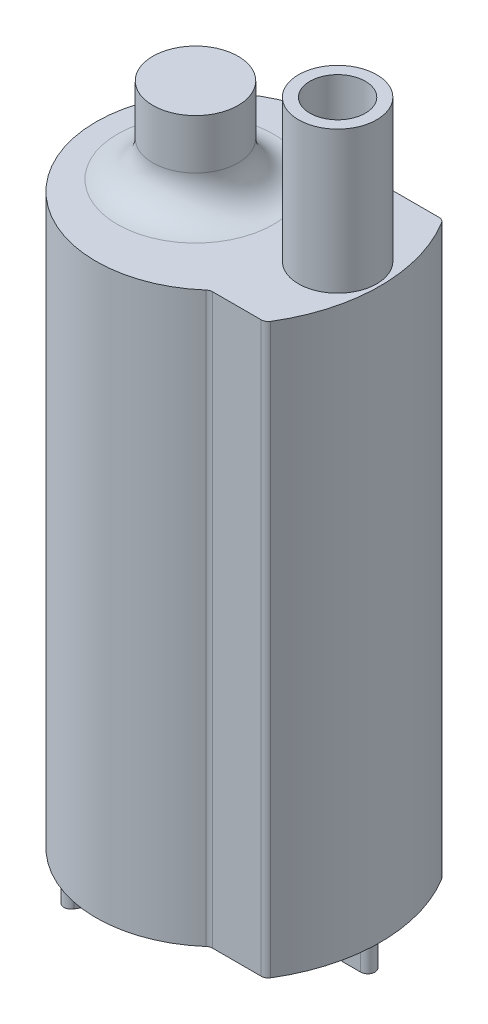
ISO-10303-21;
HEADER;
FILE_DESCRIPTION(('STEP AP214'),'2;1');
FILE_NAME('part.step','',(''),(''),'','','');
FILE_SCHEMA(('AUTOMOTIVE_DESIGN { 1 0 10303 214 1 1 1 1 }'));
ENDSEC;
DATA;
#1=APPLICATION_CONTEXT('core data for automotive mechanical design processes');
#2=APPLICATION_PROTOCOL_DEFINITION('international standard','automotive_design',2000,#1);
#3=PRODUCT_CONTEXT('',#1,'mechanical');
#4=PRODUCT('Part','Part','',(#3));
#5=PRODUCT_RELATED_PRODUCT_CATEGORY('part','',(#4));
#6=PRODUCT_DEFINITION_FORMATION('','',#4);
#7=PRODUCT_DEFINITION_CONTEXT('part definition',#1,'design');
#8=PRODUCT_DEFINITION('design','',#6,#7);
#9=PRODUCT_DEFINITION_SHAPE('','',#8);
#10=(LENGTH_UNIT() NAMED_UNIT(*) SI_UNIT(.MILLI.,.METRE.));
#11=(NAMED_UNIT(*) PLANE_ANGLE_UNIT() SI_UNIT($,.RADIAN.));
#12=(NAMED_UNIT(*) SI_UNIT($,.STERADIAN.) SOLID_ANGLE_UNIT());
#13=UNCERTAINTY_MEASURE_WITH_UNIT(LENGTH_MEASURE(1.E-05),#10,'distance_accuracy_value','');
#14=(GEOMETRIC_REPRESENTATION_CONTEXT(3) GLOBAL_UNCERTAINTY_ASSIGNED_CONTEXT((#13)) GLOBAL_UNIT_ASSIGNED_CONTEXT((#10,
#11,#12)) REPRESENTATION_CONTEXT('',''));
#15=CARTESIAN_POINT('',(0.,0.,0.));
#16=DIRECTION('',(0.,0.,1.));
#17=DIRECTION('',(1.,0.,0.));
#18=AXIS2_PLACEMENT_3D('',#15,#16,#17);
#19=CARTESIAN_POINT('',(0.,0.,0.));
#20=DIRECTION('',(0.,1.,0.));
#21=DIRECTION('',(0.,0.,1.));
#22=AXIS2_PLACEMENT_3D('',#19,#20,#21);
#23=PLANE('',#22);
#24=CARTESIAN_POINT('',(-6.25000000000005,0.,-10.8253175473055));
#25=DIRECTION('',(0.,-1.,0.));
#26=DIRECTION('',(0.,0.,-1.));
#27=AXIS2_PLACEMENT_3D('',#24,#25,#26);
#28=CIRCLE('',#27,0.999999999999999);
#29=CARTESIAN_POINT('',(-5.38397459621561,0.,-11.3253175473055));
#30=VERTEX_POINT('',#29);
#31=CARTESIAN_POINT('',(-7.11602540378449,0.,-10.3253175473055));
#32=VERTEX_POINT('',#31);
#33=EDGE_CURVE('E194',#30,#32,#28,.T.);
#34=ORIENTED_EDGE('',*,*,#33,.F.);
#35=DIRECTION('',(0.500000000000004,0.,0.866025403784436));
#36=VECTOR('',#35,1.);
#37=CARTESIAN_POINT('',(-5.38397459621561,0.,-11.3253175473055));
#38=LINE('',#37,#36);
#39=CARTESIAN_POINT('',(-6.63397459621563,0.,-13.4903810567665));
#40=VERTEX_POINT('',#39);
#41=EDGE_CURVE('E207',#40,#30,#38,.T.);
#42=ORIENTED_EDGE('',*,*,#41,.F.);
#43=CARTESIAN_POINT('',(-7.50000000000006,0.,-12.9903810567665));
#44=DIRECTION('',(0.,-1.,0.));
#45=DIRECTION('',(0.,0.,-1.));
#46=AXIS2_PLACEMENT_3D('',#43,#44,#45);
#47=CIRCLE('',#46,0.999999999999998);
#48=CARTESIAN_POINT('',(-8.3660254037845,0.,-12.4903810567665));
#49=VERTEX_POINT('',#48);
#50=EDGE_CURVE('E216',#49,#40,#47,.T.);
#51=ORIENTED_EDGE('',*,*,#50,.F.);
#52=DIRECTION('',(-0.500000000000003,0.,-0.866025403784437));
#53=VECTOR('',#52,1.);
#54=CARTESIAN_POINT('',(-7.11602540378449,0.,-10.3253175473055));
#55=LINE('',#54,#53);
#56=EDGE_CURVE('E197',#32,#49,#55,.T.);
#57=ORIENTED_EDGE('',*,*,#56,.F.);
#58=EDGE_LOOP('',(#34,#42,#51,#57));
#59=FACE_BOUND('',#58,.T.);
#60=DIRECTION('',(-1.,0.,0.));
#61=VECTOR('',#60,1.);
#62=CARTESIAN_POINT('',(11.5217186218029,0.,-12.5));
#63=LINE('',#62,#61);
#64=CARTESIAN_POINT('',(18.7549993335111,0.,-12.5));
#65=VERTEX_POINT('',#64);
#66=CARTESIAN_POINT('',(11.9058808997907,0.,-12.5));
#67=VERTEX_POINT('',#66);
#68=EDGE_CURVE('E281',#65,#67,#63,.T.);
#69=ORIENTED_EDGE('',*,*,#68,.F.);
#70=CARTESIAN_POINT('',(18.7549993335111,0.,-11.5));
#71=DIRECTION('',(0.,1.,0.));
#72=DIRECTION('',(0.,0.,1.));
#73=AXIS2_PLACEMENT_3D('',#70,#71,#72);
#74=CIRCLE('',#73,1.);
#75=CARTESIAN_POINT('',(19.6074993032161,0.,-12.0227272727273));
#76=VERTEX_POINT('',#75);
#77=EDGE_CURVE('E314',#65,#76,#74,.F.);
#78=ORIENTED_EDGE('',*,*,#77,.T.);
#79=CARTESIAN_POINT('',(0.,0.,0.));
#80=DIRECTION('',(0.,1.,0.));
#81=DIRECTION('',(0.,0.,1.));
#82=AXIS2_PLACEMENT_3D('',#79,#80,#81);
#83=CIRCLE('',#82,23.);
#84=CARTESIAN_POINT('',(19.6074993032161,0.,12.0227272727273));
#85=VERTEX_POINT('',#84);
#86=EDGE_CURVE('E294',#85,#76,#83,.T.);
#87=ORIENTED_EDGE('',*,*,#86,.F.);
#88=CARTESIAN_POINT('',(18.7549993335111,0.,11.5));
#89=DIRECTION('',(0.,1.,0.));
#90=DIRECTION('',(0.,0.,1.));
#91=AXIS2_PLACEMENT_3D('',#88,#89,#90);
#92=CIRCLE('',#91,1.);
#93=CARTESIAN_POINT('',(18.7549993335111,0.,12.5));
#94=VERTEX_POINT('',#93);
#95=EDGE_CURVE('E312',#85,#94,#92,.F.);
#96=ORIENTED_EDGE('',*,*,#95,.T.);
#97=DIRECTION('',(1.,0.,0.));
#98=VECTOR('',#97,1.);
#99=CARTESIAN_POINT('',(19.3067345763078,0.,12.5));
#100=LINE('',#99,#98);
#101=CARTESIAN_POINT('',(11.9058808997907,0.,12.5));
#102=VERTEX_POINT('',#101);
#103=EDGE_CURVE('E292',#102,#94,#100,.T.);
#104=ORIENTED_EDGE('',*,*,#103,.F.);
#105=CARTESIAN_POINT('',(11.9058808997907,0.,13.5));
#106=DIRECTION('',(0.,1.,0.));
#107=DIRECTION('',(0.,0.,1.));
#108=AXIS2_PLACEMENT_3D('',#105,#106,#107);
#109=CIRCLE('',#108,1.);
#110=CARTESIAN_POINT('',(11.2444430720245,0.,12.75));
#111=VERTEX_POINT('',#110);
#112=EDGE_CURVE('E40',#102,#111,#109,.T.);
#113=ORIENTED_EDGE('',*,*,#112,.T.);
#114=CARTESIAN_POINT('',(0.,0.,0.));
#115=DIRECTION('',(0.,1.,0.));
#116=DIRECTION('',(0.,0.,1.));
#117=AXIS2_PLACEMENT_3D('',#114,#115,#116);
#118=CIRCLE('',#117,17.);
#119=CARTESIAN_POINT('',(11.2444430720245,0.,-12.75));
#120=VERTEX_POINT('',#119);
#121=EDGE_CURVE('E275',#120,#111,#118,.T.);
#122=ORIENTED_EDGE('',*,*,#121,.F.);
#123=CARTESIAN_POINT('',(11.9058808997907,0.,-13.5));
#124=DIRECTION('',(0.,1.,0.));
#125=DIRECTION('',(0.,0.,1.));
#126=AXIS2_PLACEMENT_3D('',#123,#124,#125);
#127=CIRCLE('',#126,1.);
#128=EDGE_CURVE('E334',#120,#67,#127,.T.);
#129=ORIENTED_EDGE('',*,*,#128,.T.);
#130=EDGE_LOOP('',(#69,#78,#87,#96,#104,#113,#122,#129));
#131=FACE_BOUND('',#130,.T.);
#132=CARTESIAN_POINT('',(-6.25000000000005,0.,10.8253175473054));
#133=DIRECTION('',(0.,-1.,0.));
#134=DIRECTION('',(0.,0.,-1.));
#135=AXIS2_PLACEMENT_3D('',#132,#133,#134);
#136=CIRCLE('',#135,1.);
#137=CARTESIAN_POINT('',(-7.11602540378449,0.,10.3253175473054));
#138=VERTEX_POINT('',#137);
#139=CARTESIAN_POINT('',(-5.38397459621562,0.,11.3253175473055));
#140=VERTEX_POINT('',#139);
#141=EDGE_CURVE('E232',#138,#140,#136,.T.);
#142=ORIENTED_EDGE('',*,*,#141,.F.);
#143=DIRECTION('',(0.500000000000005,0.,-0.866025403784436));
#144=VECTOR('',#143,1.);
#145=CARTESIAN_POINT('',(-7.11602540378449,0.,10.3253175473054));
#146=LINE('',#145,#144);
#147=CARTESIAN_POINT('',(-8.3660254037845,0.,12.4903810567665));
#148=VERTEX_POINT('',#147);
#149=EDGE_CURVE('E237',#148,#138,#146,.T.);
#150=ORIENTED_EDGE('',*,*,#149,.F.);
#151=CARTESIAN_POINT('',(-7.50000000000006,0.,12.9903810567665));
#152=DIRECTION('',(0.,-1.,0.));
#153=DIRECTION('',(0.,0.,-1.));
#154=AXIS2_PLACEMENT_3D('',#151,#152,#153);
#155=CIRCLE('',#154,1.);
#156=CARTESIAN_POINT('',(-6.63397459621563,0.,13.4903810567665));
#157=VERTEX_POINT('',#156);
#158=EDGE_CURVE('E249',#157,#148,#155,.T.);
#159=ORIENTED_EDGE('',*,*,#158,.F.);
#160=DIRECTION('',(-0.500000000000004,0.,0.866025403784436));
#161=VECTOR('',#160,1.);
#162=CARTESIAN_POINT('',(-5.38397459621562,0.,11.3253175473055));
#163=LINE('',#162,#161);
#164=EDGE_CURVE('E246',#140,#157,#163,.T.);
#165=ORIENTED_EDGE('',*,*,#164,.F.);
#166=EDGE_LOOP('',(#142,#150,#159,#165));
#167=FACE_BOUND('',#166,.T.);
#168=CARTESIAN_POINT('',(18.75,0.,0.));
#169=DIRECTION('',(0.,-1.,0.));
#170=DIRECTION('',(0.,0.,-1.));
#171=AXIS2_PLACEMENT_3D('',#168,#169,#170);
#172=CIRCLE('',#171,1.);
#173=CARTESIAN_POINT('',(18.75,0.,1.));
#174=VERTEX_POINT('',#173);
#175=CARTESIAN_POINT('',(18.75,0.,-1.));
#176=VERTEX_POINT('',#175);
#177=EDGE_CURVE('E193',#174,#176,#172,.T.);
#178=ORIENTED_EDGE('',*,*,#177,.F.);
#179=DIRECTION('',(-1.,0.,0.));
#180=VECTOR('',#179,1.);
#181=CARTESIAN_POINT('',(18.75,0.,1.));
#182=LINE('',#181,#180);
#183=CARTESIAN_POINT('',(21.25,0.,1.));
#184=VERTEX_POINT('',#183);
#185=EDGE_CURVE('E190',#184,#174,#182,.T.);
#186=ORIENTED_EDGE('',*,*,#185,.F.);
#187=CARTESIAN_POINT('',(21.25,0.,0.));
#188=DIRECTION('',(0.,-1.,0.));
#189=DIRECTION('',(0.,0.,-1.));
#190=AXIS2_PLACEMENT_3D('',#187,#188,#189);
#191=CIRCLE('',#190,1.);
#192=CARTESIAN_POINT('',(21.25,0.,-1.));
#193=VERTEX_POINT('',#192);
#194=EDGE_CURVE('E679',#193,#184,#191,.T.);
#195=ORIENTED_EDGE('',*,*,#194,.F.);
#196=DIRECTION('',(1.,0.,0.));
#197=VECTOR('',#196,1.);
#198=CARTESIAN_POINT('',(18.75,0.,-1.));
#199=LINE('',#198,#197);
#200=EDGE_CURVE('E685',#176,#193,#199,.T.);
#201=ORIENTED_EDGE('',*,*,#200,.F.);
#202=EDGE_LOOP('',(#178,#186,#195,#201));
#203=FACE_BOUND('',#202,.T.);
#204=ADVANCED_FACE('F32',(#59,#131,#167,#203),#23,.F.);
#205=CARTESIAN_POINT('',(0.,80.,0.));
#206=DIRECTION('',(0.,-1.,0.));
#207=DIRECTION('',(0.,0.,-1.));
#208=AXIS2_PLACEMENT_3D('',#205,#206,#207);
#209=CYLINDRICAL_SURFACE('',#208,17.);
#210=CARTESIAN_POINT('',(0.,80.,0.));
#211=DIRECTION('',(0.,1.,0.));
#212=DIRECTION('',(0.,0.,1.));
#213=AXIS2_PLACEMENT_3D('',#210,#211,#212);
#214=CIRCLE('',#213,17.);
#215=CARTESIAN_POINT('',(11.2444430720245,80.,-12.75));
#216=VERTEX_POINT('',#215);
#217=CARTESIAN_POINT('',(11.2444430720245,80.,12.75));
#218=VERTEX_POINT('',#217);
#219=EDGE_CURVE('E278',#216,#218,#214,.T.);
#220=ORIENTED_EDGE('',*,*,#219,.F.);
#221=DIRECTION('',(0.,-1.,0.));
#222=VECTOR('',#221,1.);
#223=CARTESIAN_POINT('',(11.2444430720245,80.,-12.75));
#224=LINE('',#223,#222);
#225=EDGE_CURVE('E327',#216,#120,#224,.T.);
#226=ORIENTED_EDGE('',*,*,#225,.T.);
#227=ORIENTED_EDGE('',*,*,#121,.T.);
#228=DIRECTION('',(0.,-1.,0.));
#229=VECTOR('',#228,1.);
#230=CARTESIAN_POINT('',(11.2444430720245,80.,12.75));
#231=LINE('',#230,#229);
#232=EDGE_CURVE('E325',#111,#218,#231,.F.);
#233=ORIENTED_EDGE('',*,*,#232,.T.);
#234=EDGE_LOOP('',(#220,#226,#227,#233));
#235=FACE_BOUND('',#234,.T.);
#236=ADVANCED_FACE('F347',(#235),#209,.T.);
#237=CARTESIAN_POINT('',(19.3067345763078,80.,12.5));
#238=DIRECTION('',(0.,0.,-1.));
#239=DIRECTION('',(-1.,0.,0.));
#240=AXIS2_PLACEMENT_3D('',#237,#238,#239);
#241=PLANE('',#240);
#242=ORIENTED_EDGE('',*,*,#103,.T.);
#243=DIRECTION('',(0.,-1.,0.));
#244=VECTOR('',#243,1.);
#245=CARTESIAN_POINT('',(18.7549993335111,80.,12.5));
#246=LINE('',#245,#244);
#247=CARTESIAN_POINT('',(18.7549993335111,80.,12.5));
#248=VERTEX_POINT('',#247);
#249=EDGE_CURVE('E47',#94,#248,#246,.F.);
#250=ORIENTED_EDGE('',*,*,#249,.T.);
#251=DIRECTION('',(1.,0.,0.));
#252=VECTOR('',#251,1.);
#253=CARTESIAN_POINT('',(19.3067345763078,80.,12.5));
#254=LINE('',#253,#252);
#255=CARTESIAN_POINT('',(11.9058808997907,80.,12.5));
#256=VERTEX_POINT('',#255);
#257=EDGE_CURVE('E280',#256,#248,#254,.T.);
#258=ORIENTED_EDGE('',*,*,#257,.F.);
#259=DIRECTION('',(0.,1.,0.));
#260=VECTOR('',#259,1.);
#261=CARTESIAN_POINT('',(11.9058808997907,0.,12.5));
#262=LINE('',#261,#260);
#263=EDGE_CURVE('E330',#256,#102,#262,.F.);
#264=ORIENTED_EDGE('',*,*,#263,.T.);
#265=EDGE_LOOP('',(#242,#250,#258,#264));
#266=FACE_BOUND('',#265,.T.);
#267=ADVANCED_FACE('F349',(#266),#241,.F.);
#268=CARTESIAN_POINT('',(0.,80.,0.));
#269=DIRECTION('',(0.,-1.,0.));
#270=DIRECTION('',(0.,0.,-1.));
#271=AXIS2_PLACEMENT_3D('',#268,#269,#270);
#272=CYLINDRICAL_SURFACE('',#271,23.);
#273=ORIENTED_EDGE('',*,*,#86,.T.);
#274=DIRECTION('',(0.,-1.,0.));
#275=VECTOR('',#274,1.);
#276=CARTESIAN_POINT('',(19.6074993032161,80.,-12.0227272727273));
#277=LINE('',#276,#275);
#278=CARTESIAN_POINT('',(19.6074993032161,80.,-12.0227272727273));
#279=VERTEX_POINT('',#278);
#280=EDGE_CURVE('E319',#76,#279,#277,.F.);
#281=ORIENTED_EDGE('',*,*,#280,.T.);
#282=CARTESIAN_POINT('',(0.,80.,0.));
#283=DIRECTION('',(0.,1.,0.));
#284=DIRECTION('',(0.,0.,1.));
#285=AXIS2_PLACEMENT_3D('',#282,#283,#284);
#286=CIRCLE('',#285,23.);
#287=CARTESIAN_POINT('',(19.6074993032161,80.,12.0227272727273));
#288=VERTEX_POINT('',#287);
#289=EDGE_CURVE('E283',#288,#279,#286,.T.);
#290=ORIENTED_EDGE('',*,*,#289,.F.);
#291=DIRECTION('',(0.,-1.,0.));
#292=VECTOR('',#291,1.);
#293=CARTESIAN_POINT('',(19.6074993032161,80.,12.0227272727273));
#294=LINE('',#293,#292);
#295=EDGE_CURVE('E316',#288,#85,#294,.T.);
#296=ORIENTED_EDGE('',*,*,#295,.T.);
#297=EDGE_LOOP('',(#273,#281,#290,#296));
#298=FACE_BOUND('',#297,.T.);
#299=ADVANCED_FACE('F358',(#298),#272,.T.);
#300=CARTESIAN_POINT('',(11.5217186218029,80.,-12.5));
#301=DIRECTION('',(0.,0.,1.));
#302=DIRECTION('',(1.,0.,0.));
#303=AXIS2_PLACEMENT_3D('',#300,#301,#302);
#304=PLANE('',#303);
#305=DIRECTION('',(-1.,0.,0.));
#306=VECTOR('',#305,1.);
#307=CARTESIAN_POINT('',(11.5217186218029,80.,-12.5));
#308=LINE('',#307,#306);
#309=CARTESIAN_POINT('',(18.7549993335111,80.,-12.5));
#310=VERTEX_POINT('',#309);
#311=CARTESIAN_POINT('',(11.9058808997907,80.,-12.5));
#312=VERTEX_POINT('',#311);
#313=EDGE_CURVE('E286',#310,#312,#308,.T.);
#314=ORIENTED_EDGE('',*,*,#313,.F.);
#315=DIRECTION('',(0.,-1.,0.));
#316=VECTOR('',#315,1.);
#317=CARTESIAN_POINT('',(18.7549993335111,80.,-12.5));
#318=LINE('',#317,#316);
#319=EDGE_CURVE('E309',#310,#65,#318,.T.);
#320=ORIENTED_EDGE('',*,*,#319,.T.);
#321=ORIENTED_EDGE('',*,*,#68,.T.);
#322=DIRECTION('',(0.,1.,0.));
#323=VECTOR('',#322,1.);
#324=CARTESIAN_POINT('',(11.9058808997907,80.,-12.5));
#325=LINE('',#324,#323);
#326=EDGE_CURVE('E307',#67,#312,#325,.T.);
#327=ORIENTED_EDGE('',*,*,#326,.T.);
#328=EDGE_LOOP('',(#314,#320,#321,#327));
#329=FACE_BOUND('',#328,.T.);
#330=ADVANCED_FACE('F366',(#329),#304,.F.);
#331=CARTESIAN_POINT('',(0.,80.,0.));
#332=DIRECTION('',(0.,1.,0.));
#333=DIRECTION('',(0.,0.,1.));
#334=AXIS2_PLACEMENT_3D('',#331,#332,#333);
#335=PLANE('',#334);
#336=CARTESIAN_POINT('',(-3.,80.,0.));
#337=DIRECTION('',(0.,1.,0.));
#338=DIRECTION('',(0.,0.,1.));
#339=AXIS2_PLACEMENT_3D('',#336,#337,#338);
#340=CIRCLE('',#339,11.);
#341=CARTESIAN_POINT('',(-3.,80.,11.));
#342=VERTEX_POINT('',#341);
#343=EDGE_CURVE('E304',#342,#342,#340,.F.);
#344=ORIENTED_EDGE('',*,*,#343,.T.);
#345=EDGE_LOOP('',(#344));
#346=FACE_BOUND('',#345,.T.);
#347=CARTESIAN_POINT('',(17.,80.,0.));
#348=DIRECTION('',(0.,1.,0.));
#349=DIRECTION('',(0.,0.,1.));
#350=AXIS2_PLACEMENT_3D('',#347,#348,#349);
#351=CIRCLE('',#350,5.5);
#352=CARTESIAN_POINT('',(17.,80.,5.5));
#353=VERTEX_POINT('',#352);
#354=EDGE_CURVE('E271',#353,#353,#351,.T.);
#355=ORIENTED_EDGE('',*,*,#354,.F.);
#356=EDGE_LOOP('',(#355));
#357=FACE_BOUND('',#356,.T.);
#358=ORIENTED_EDGE('',*,*,#289,.T.);
#359=CARTESIAN_POINT('',(18.7549993335111,80.,-11.5));
#360=DIRECTION('',(0.,1.,0.));
#361=DIRECTION('',(0.,0.,1.));
#362=AXIS2_PLACEMENT_3D('',#359,#360,#361);
#363=CIRCLE('',#362,1.);
#364=EDGE_CURVE('E323',#279,#310,#363,.T.);
#365=ORIENTED_EDGE('',*,*,#364,.T.);
#366=ORIENTED_EDGE('',*,*,#313,.T.);
#367=CARTESIAN_POINT('',(11.9058808997907,80.,-13.5));
#368=DIRECTION('',(0.,1.,0.));
#369=DIRECTION('',(0.,0.,1.));
#370=AXIS2_PLACEMENT_3D('',#367,#368,#369);
#371=CIRCLE('',#370,1.);
#372=EDGE_CURVE('E336',#312,#216,#371,.F.);
#373=ORIENTED_EDGE('',*,*,#372,.T.);
#374=ORIENTED_EDGE('',*,*,#219,.T.);
#375=CARTESIAN_POINT('',(11.9058808997907,80.,13.5));
#376=DIRECTION('',(0.,1.,0.));
#377=DIRECTION('',(0.,0.,1.));
#378=AXIS2_PLACEMENT_3D('',#375,#376,#377);
#379=CIRCLE('',#378,1.);
#380=EDGE_CURVE('E11',#218,#256,#379,.F.);
#381=ORIENTED_EDGE('',*,*,#380,.T.);
#382=ORIENTED_EDGE('',*,*,#257,.T.);
#383=CARTESIAN_POINT('',(18.7549993335111,80.,11.5));
#384=DIRECTION('',(0.,1.,0.));
#385=DIRECTION('',(0.,0.,1.));
#386=AXIS2_PLACEMENT_3D('',#383,#384,#385);
#387=CIRCLE('',#386,1.);
#388=EDGE_CURVE('E321',#248,#288,#387,.T.);
#389=ORIENTED_EDGE('',*,*,#388,.T.);
#390=EDGE_LOOP('',(#358,#365,#366,#373,#374,#381,#382,#389));
#391=FACE_BOUND('',#390,.T.);
#392=ADVANCED_FACE('F351',(#346,#357,#391),#335,.T.);
#393=CARTESIAN_POINT('',(17.,100.,0.));
#394=DIRECTION('',(0.,1.,0.));
#395=DIRECTION('',(0.,0.,1.));
#396=AXIS2_PLACEMENT_3D('',#393,#394,#395);
#397=PLANE('',#396);
#398=CARTESIAN_POINT('',(17.,100.,0.));
#399=DIRECTION('',(0.,1.,0.));
#400=DIRECTION('',(0.,0.,1.));
#401=AXIS2_PLACEMENT_3D('',#398,#399,#400);
#402=CIRCLE('',#401,5.5);
#403=CARTESIAN_POINT('',(17.,100.,5.5));
#404=VERTEX_POINT('',#403);
#405=EDGE_CURVE('E272',#404,#404,#402,.T.);
#406=ORIENTED_EDGE('',*,*,#405,.T.);
#407=EDGE_LOOP('',(#406));
#408=FACE_BOUND('',#407,.T.);
#409=CARTESIAN_POINT('',(17.,100.,0.));
#410=DIRECTION('',(0.,1.,0.));
#411=DIRECTION('',(0.,0.,1.));
#412=AXIS2_PLACEMENT_3D('',#409,#410,#411);
#413=CIRCLE('',#412,3.9);
#414=CARTESIAN_POINT('',(17.,100.,3.9));
#415=VERTEX_POINT('',#414);
#416=EDGE_CURVE('E268',#415,#415,#413,.T.);
#417=ORIENTED_EDGE('',*,*,#416,.F.);
#418=EDGE_LOOP('',(#417));
#419=FACE_BOUND('',#418,.T.);
#420=ADVANCED_FACE('F428',(#408,#419),#397,.T.);
#421=CARTESIAN_POINT('',(17.,100.,0.));
#422=DIRECTION('',(0.,-1.,0.));
#423=DIRECTION('',(0.,0.,-1.));
#424=AXIS2_PLACEMENT_3D('',#421,#422,#423);
#425=CYLINDRICAL_SURFACE('',#424,5.5);
#426=ORIENTED_EDGE('',*,*,#405,.F.);
#427=EDGE_LOOP('',(#426));
#428=FACE_BOUND('',#427,.T.);
#429=ORIENTED_EDGE('',*,*,#354,.T.);
#430=EDGE_LOOP('',(#429));
#431=FACE_BOUND('',#430,.T.);
#432=ADVANCED_FACE('F426',(#428,#431),#425,.T.);
#433=CARTESIAN_POINT('',(17.,100.,0.));
#434=DIRECTION('',(0.,-1.,0.));
#435=DIRECTION('',(0.,0.,-1.));
#436=AXIS2_PLACEMENT_3D('',#433,#434,#435);
#437=CYLINDRICAL_SURFACE('',#436,3.9);
#438=ORIENTED_EDGE('',*,*,#416,.T.);
#439=EDGE_LOOP('',(#438));
#440=FACE_BOUND('',#439,.T.);
#441=CARTESIAN_POINT('',(17.,80.,0.));
#442=DIRECTION('',(0.,1.,0.));
#443=DIRECTION('',(0.,0.,1.));
#444=AXIS2_PLACEMENT_3D('',#441,#442,#443);
#445=CIRCLE('',#444,3.9);
#446=CARTESIAN_POINT('',(17.,80.,3.9));
#447=VERTEX_POINT('',#446);
#448=EDGE_CURVE('E289',#447,#447,#445,.F.);
#449=ORIENTED_EDGE('',*,*,#448,.T.);
#450=EDGE_LOOP('',(#449));
#451=FACE_BOUND('',#450,.T.);
#452=ADVANCED_FACE('F421',(#440,#451),#437,.F.);
#453=ORIENTED_EDGE('',*,*,#448,.F.);
#454=EDGE_LOOP('',(#453));
#455=FACE_BOUND('',#454,.T.);
#456=ADVANCED_FACE('F415',(#455),#335,.T.);
#457=CARTESIAN_POINT('',(-3.,92.,0.));
#458=DIRECTION('',(0.,-1.,0.));
#459=DIRECTION('',(0.,0.,-1.));
#460=AXIS2_PLACEMENT_3D('',#457,#458,#459);
#461=CYLINDRICAL_SURFACE('',#460,6.);
#462=CARTESIAN_POINT('',(-3.,85.,0.));
#463=DIRECTION('',(0.,1.,0.));
#464=DIRECTION('',(0.,0.,1.));
#465=AXIS2_PLACEMENT_3D('',#462,#463,#464);
#466=CIRCLE('',#465,6.);
#467=CARTESIAN_POINT('',(-3.,85.,6.));
#468=VERTEX_POINT('',#467);
#469=EDGE_CURVE('E301',#468,#468,#466,.T.);
#470=ORIENTED_EDGE('',*,*,#469,.T.);
#471=EDGE_LOOP('',(#470));
#472=FACE_BOUND('',#471,.T.);
#473=CARTESIAN_POINT('',(-3.,92.,0.));
#474=DIRECTION('',(0.,1.,0.));
#475=DIRECTION('',(0.,0.,1.));
#476=AXIS2_PLACEMENT_3D('',#473,#474,#475);
#477=CIRCLE('',#476,6.);
#478=CARTESIAN_POINT('',(-3.,92.,6.));
#479=VERTEX_POINT('',#478);
#480=EDGE_CURVE('E265',#479,#479,#477,.T.);
#481=ORIENTED_EDGE('',*,*,#480,.F.);
#482=EDGE_LOOP('',(#481));
#483=FACE_BOUND('',#482,.T.);
#484=ADVANCED_FACE('F406',(#472,#483),#461,.T.);
#485=CARTESIAN_POINT('',(-3.,92.,0.));
#486=DIRECTION('',(0.,1.,0.));
#487=DIRECTION('',(0.,0.,1.));
#488=AXIS2_PLACEMENT_3D('',#485,#486,#487);
#489=PLANE('',#488);
#490=ORIENTED_EDGE('',*,*,#480,.T.);
#491=EDGE_LOOP('',(#490));
#492=FACE_BOUND('',#491,.T.);
#493=ADVANCED_FACE('F397',(#492),#489,.T.);
#494=CARTESIAN_POINT('',(-3.,85.,0.));
#495=DIRECTION('',(0.,1.,0.));
#496=DIRECTION('',(0.,0.,1.));
#497=AXIS2_PLACEMENT_3D('',#494,#495,#496);
#498=TOROIDAL_SURFACE('',#497,11.,5.);
#499=ORIENTED_EDGE('',*,*,#343,.F.);
#500=EDGE_LOOP('',(#499));
#501=FACE_BOUND('',#500,.T.);
#502=ORIENTED_EDGE('',*,*,#469,.F.);
#503=EDGE_LOOP('',(#502));
#504=FACE_BOUND('',#503,.T.);
#505=ADVANCED_FACE('F394',(#501,#504),#498,.F.);
#506=CARTESIAN_POINT('',(-6.25000000000005,-4.,10.8253175473054));
#507=DIRECTION('',(0.,1.,0.));
#508=DIRECTION('',(0.,0.,1.));
#509=AXIS2_PLACEMENT_3D('',#506,#507,#508);
#510=CYLINDRICAL_SURFACE('',#509,1.);
#511=ORIENTED_EDGE('',*,*,#141,.T.);
#512=DIRECTION('',(0.,1.,0.));
#513=VECTOR('',#512,1.);
#514=CARTESIAN_POINT('',(-5.38397459621562,-4.,11.3253175473055));
#515=LINE('',#514,#513);
#516=CARTESIAN_POINT('',(-5.38397459621562,-4.,11.3253175473055));
#517=VERTEX_POINT('',#516);
#518=EDGE_CURVE('E262',#517,#140,#515,.T.);
#519=ORIENTED_EDGE('',*,*,#518,.F.);
#520=CARTESIAN_POINT('',(-6.25000000000005,-4.,10.8253175473054));
#521=DIRECTION('',(0.,-1.,0.));
#522=DIRECTION('',(0.,0.,-1.));
#523=AXIS2_PLACEMENT_3D('',#520,#521,#522);
#524=CIRCLE('',#523,1.);
#525=CARTESIAN_POINT('',(-7.11602540378449,-4.,10.3253175473054));
#526=VERTEX_POINT('',#525);
#527=EDGE_CURVE('E233',#526,#517,#524,.T.);
#528=ORIENTED_EDGE('',*,*,#527,.F.);
#529=DIRECTION('',(0.,1.,0.));
#530=VECTOR('',#529,1.);
#531=CARTESIAN_POINT('',(-7.11602540378449,-4.,10.3253175473054));
#532=LINE('',#531,#530);
#533=EDGE_CURVE('E243',#526,#138,#532,.T.);
#534=ORIENTED_EDGE('',*,*,#533,.T.);
#535=EDGE_LOOP('',(#511,#519,#528,#534));
#536=FACE_BOUND('',#535,.T.);
#537=ADVANCED_FACE('F396',(#536),#510,.T.);
#538=CARTESIAN_POINT('',(-5.38397459621562,-4.,11.3253175473055));
#539=DIRECTION('',(-0.866025403784436,0.,-0.500000000000004));
#540=DIRECTION('',(-0.500000000000004,0.,0.866025403784436));
#541=AXIS2_PLACEMENT_3D('',#538,#539,#540);
#542=PLANE('',#541);
#543=ORIENTED_EDGE('',*,*,#164,.T.);
#544=DIRECTION('',(0.,1.,0.));
#545=VECTOR('',#544,1.);
#546=CARTESIAN_POINT('',(-6.63397459621563,-4.,13.4903810567665));
#547=LINE('',#546,#545);
#548=CARTESIAN_POINT('',(-6.63397459621563,-4.,13.4903810567665));
#549=VERTEX_POINT('',#548);
#550=EDGE_CURVE('E259',#549,#157,#547,.T.);
#551=ORIENTED_EDGE('',*,*,#550,.F.);
#552=DIRECTION('',(-0.500000000000004,0.,0.866025403784436));
#553=VECTOR('',#552,1.);
#554=CARTESIAN_POINT('',(-5.38397459621562,-4.,11.3253175473055));
#555=LINE('',#554,#553);
#556=EDGE_CURVE('E236',#517,#549,#555,.T.);
#557=ORIENTED_EDGE('',*,*,#556,.F.);
#558=ORIENTED_EDGE('',*,*,#518,.T.);
#559=EDGE_LOOP('',(#543,#551,#557,#558));
#560=FACE_BOUND('',#559,.T.);
#561=ADVANCED_FACE('F403',(#560),#542,.F.);
#562=CARTESIAN_POINT('',(-7.50000000000006,-4.,12.9903810567665));
#563=DIRECTION('',(0.,1.,0.));
#564=DIRECTION('',(0.,0.,1.));
#565=AXIS2_PLACEMENT_3D('',#562,#563,#564);
#566=CYLINDRICAL_SURFACE('',#565,1.);
#567=ORIENTED_EDGE('',*,*,#158,.T.);
#568=DIRECTION('',(0.,1.,0.));
#569=VECTOR('',#568,1.);
#570=CARTESIAN_POINT('',(-8.3660254037845,-4.,12.4903810567665));
#571=LINE('',#570,#569);
#572=CARTESIAN_POINT('',(-8.3660254037845,-4.,12.4903810567665));
#573=VERTEX_POINT('',#572);
#574=EDGE_CURVE('E256',#573,#148,#571,.T.);
#575=ORIENTED_EDGE('',*,*,#574,.F.);
#576=CARTESIAN_POINT('',(-7.50000000000006,-4.,12.9903810567665));
#577=DIRECTION('',(0.,-1.,0.));
#578=DIRECTION('',(0.,0.,-1.));
#579=AXIS2_PLACEMENT_3D('',#576,#577,#578);
#580=CIRCLE('',#579,1.);
#581=EDGE_CURVE('E239',#549,#573,#580,.T.);
#582=ORIENTED_EDGE('',*,*,#581,.F.);
#583=ORIENTED_EDGE('',*,*,#550,.T.);
#584=EDGE_LOOP('',(#567,#575,#582,#583));
#585=FACE_BOUND('',#584,.T.);
#586=ADVANCED_FACE('F496',(#585),#566,.T.);
#587=CARTESIAN_POINT('',(-7.11602540378449,-4.,10.3253175473054));
#588=DIRECTION('',(0.866025403784436,0.,0.500000000000005));
#589=DIRECTION('',(0.500000000000005,0.,-0.866025403784436));
#590=AXIS2_PLACEMENT_3D('',#587,#588,#589);
#591=PLANE('',#590);
#592=ORIENTED_EDGE('',*,*,#149,.T.);
#593=ORIENTED_EDGE('',*,*,#533,.F.);
#594=DIRECTION('',(0.500000000000005,0.,-0.866025403784436));
#595=VECTOR('',#594,1.);
#596=CARTESIAN_POINT('',(-7.11602540378449,-4.,10.3253175473054));
#597=LINE('',#596,#595);
#598=EDGE_CURVE('E241',#573,#526,#597,.T.);
#599=ORIENTED_EDGE('',*,*,#598,.F.);
#600=ORIENTED_EDGE('',*,*,#574,.T.);
#601=EDGE_LOOP('',(#592,#593,#599,#600));
#602=FACE_BOUND('',#601,.T.);
#603=ADVANCED_FACE('F506',(#602),#591,.F.);
#604=CARTESIAN_POINT('',(-6.25000000000005,-4.,10.8253175473054));
#605=DIRECTION('',(0.,-1.,0.));
#606=DIRECTION('',(0.,0.,-1.));
#607=AXIS2_PLACEMENT_3D('',#604,#605,#606);
#608=PLANE('',#607);
#609=ORIENTED_EDGE('',*,*,#527,.T.);
#610=ORIENTED_EDGE('',*,*,#556,.T.);
#611=ORIENTED_EDGE('',*,*,#581,.T.);
#612=ORIENTED_EDGE('',*,*,#598,.T.);
#613=EDGE_LOOP('',(#609,#610,#611,#612));
#614=FACE_BOUND('',#613,.T.);
#615=ADVANCED_FACE('F516',(#614),#608,.T.);
#616=CARTESIAN_POINT('',(-6.25000000000005,-4.,-10.8253175473055));
#617=DIRECTION('',(0.,1.,0.));
#618=DIRECTION('',(0.,0.,1.));
#619=AXIS2_PLACEMENT_3D('',#616,#617,#618);
#620=CYLINDRICAL_SURFACE('',#619,0.999999999999999);
#621=ORIENTED_EDGE('',*,*,#33,.T.);
#622=DIRECTION('',(0.,1.,0.));
#623=VECTOR('',#622,1.);
#624=CARTESIAN_POINT('',(-7.11602540378449,-4.,-10.3253175473055));
#625=LINE('',#624,#623);
#626=CARTESIAN_POINT('',(-7.11602540378449,-4.,-10.3253175473055));
#627=VERTEX_POINT('',#626);
#628=EDGE_CURVE('E229',#627,#32,#625,.T.);
#629=ORIENTED_EDGE('',*,*,#628,.F.);
#630=CARTESIAN_POINT('',(-6.25000000000005,-4.,-10.8253175473055));
#631=DIRECTION('',(0.,-1.,0.));
#632=DIRECTION('',(0.,0.,-1.));
#633=AXIS2_PLACEMENT_3D('',#630,#631,#632);
#634=CIRCLE('',#633,0.999999999999999);
#635=CARTESIAN_POINT('',(-5.38397459621561,-4.,-11.3253175473055));
#636=VERTEX_POINT('',#635);
#637=EDGE_CURVE('E203',#636,#627,#634,.T.);
#638=ORIENTED_EDGE('',*,*,#637,.F.);
#639=DIRECTION('',(0.,1.,0.));
#640=VECTOR('',#639,1.);
#641=CARTESIAN_POINT('',(-5.38397459621561,-4.,-11.3253175473055));
#642=LINE('',#641,#640);
#643=EDGE_CURVE('E212',#636,#30,#642,.T.);
#644=ORIENTED_EDGE('',*,*,#643,.T.);
#645=EDGE_LOOP('',(#621,#629,#638,#644));
#646=FACE_BOUND('',#645,.T.);
#647=ADVANCED_FACE('F526',(#646),#620,.T.);
#648=CARTESIAN_POINT('',(-7.11602540378449,-4.,-10.3253175473055));
#649=DIRECTION('',(0.866025403784437,0.,-0.500000000000003));
#650=DIRECTION('',(-0.500000000000003,0.,-0.866025403784437));
#651=AXIS2_PLACEMENT_3D('',#648,#649,#650);
#652=PLANE('',#651);
#653=ORIENTED_EDGE('',*,*,#56,.T.);
#654=DIRECTION('',(0.,1.,0.));
#655=VECTOR('',#654,1.);
#656=CARTESIAN_POINT('',(-8.3660254037845,-4.,-12.4903810567665));
#657=LINE('',#656,#655);
#658=CARTESIAN_POINT('',(-8.3660254037845,-4.,-12.4903810567665));
#659=VERTEX_POINT('',#658);
#660=EDGE_CURVE('E226',#659,#49,#657,.T.);
#661=ORIENTED_EDGE('',*,*,#660,.F.);
#662=DIRECTION('',(-0.500000000000003,0.,-0.866025403784437));
#663=VECTOR('',#662,1.);
#664=CARTESIAN_POINT('',(-7.11602540378449,-4.,-10.3253175473055));
#665=LINE('',#664,#663);
#666=EDGE_CURVE('E206',#627,#659,#665,.T.);
#667=ORIENTED_EDGE('',*,*,#666,.F.);
#668=ORIENTED_EDGE('',*,*,#628,.T.);
#669=EDGE_LOOP('',(#653,#661,#667,#668));
#670=FACE_BOUND('',#669,.T.);
#671=ADVANCED_FACE('F536',(#670),#652,.F.);
#672=CARTESIAN_POINT('',(-7.50000000000006,-4.,-12.9903810567665));
#673=DIRECTION('',(0.,1.,0.));
#674=DIRECTION('',(0.,0.,1.));
#675=AXIS2_PLACEMENT_3D('',#672,#673,#674);
#676=CYLINDRICAL_SURFACE('',#675,0.999999999999998);
#677=ORIENTED_EDGE('',*,*,#50,.T.);
#678=DIRECTION('',(0.,1.,0.));
#679=VECTOR('',#678,1.);
#680=CARTESIAN_POINT('',(-6.63397459621563,-4.,-13.4903810567665));
#681=LINE('',#680,#679);
#682=CARTESIAN_POINT('',(-6.63397459621563,-4.,-13.4903810567665));
#683=VERTEX_POINT('',#682);
#684=EDGE_CURVE('E223',#683,#40,#681,.T.);
#685=ORIENTED_EDGE('',*,*,#684,.F.);
#686=CARTESIAN_POINT('',(-7.50000000000006,-4.,-12.9903810567665));
#687=DIRECTION('',(0.,-1.,0.));
#688=DIRECTION('',(0.,0.,-1.));
#689=AXIS2_PLACEMENT_3D('',#686,#687,#688);
#690=CIRCLE('',#689,0.999999999999998);
#691=EDGE_CURVE('E209',#659,#683,#690,.T.);
#692=ORIENTED_EDGE('',*,*,#691,.F.);
#693=ORIENTED_EDGE('',*,*,#660,.T.);
#694=EDGE_LOOP('',(#677,#685,#692,#693));
#695=FACE_BOUND('',#694,.T.);
#696=ADVANCED_FACE('F546',(#695),#676,.T.);
#697=CARTESIAN_POINT('',(-5.38397459621561,-4.,-11.3253175473055));
#698=DIRECTION('',(-0.866025403784436,0.,0.500000000000004));
#699=DIRECTION('',(0.500000000000004,0.,0.866025403784436));
#700=AXIS2_PLACEMENT_3D('',#697,#698,#699);
#701=PLANE('',#700);
#702=ORIENTED_EDGE('',*,*,#41,.T.);
#703=ORIENTED_EDGE('',*,*,#643,.F.);
#704=DIRECTION('',(0.500000000000004,0.,0.866025403784436));
#705=VECTOR('',#704,1.);
#706=CARTESIAN_POINT('',(-5.38397459621561,-4.,-11.3253175473055));
#707=LINE('',#706,#705);
#708=EDGE_CURVE('E211',#683,#636,#707,.T.);
#709=ORIENTED_EDGE('',*,*,#708,.F.);
#710=ORIENTED_EDGE('',*,*,#684,.T.);
#711=EDGE_LOOP('',(#702,#703,#709,#710));
#712=FACE_BOUND('',#711,.T.);
#713=ADVANCED_FACE('F556',(#712),#701,.F.);
#714=CARTESIAN_POINT('',(-6.25000000000005,-4.,-10.8253175473055));
#715=DIRECTION('',(0.,-1.,0.));
#716=DIRECTION('',(0.,0.,-1.));
#717=AXIS2_PLACEMENT_3D('',#714,#715,#716);
#718=PLANE('',#717);
#719=ORIENTED_EDGE('',*,*,#637,.T.);
#720=ORIENTED_EDGE('',*,*,#666,.T.);
#721=ORIENTED_EDGE('',*,*,#691,.T.);
#722=ORIENTED_EDGE('',*,*,#708,.T.);
#723=EDGE_LOOP('',(#719,#720,#721,#722));
#724=FACE_BOUND('',#723,.T.);
#725=ADVANCED_FACE('F566',(#724),#718,.T.);
#726=CARTESIAN_POINT('',(18.75,-4.,0.));
#727=DIRECTION('',(0.,1.,0.));
#728=DIRECTION('',(0.,0.,1.));
#729=AXIS2_PLACEMENT_3D('',#726,#727,#728);
#730=CYLINDRICAL_SURFACE('',#729,1.);
#731=ORIENTED_EDGE('',*,*,#177,.T.);
#732=DIRECTION('',(0.,1.,0.));
#733=VECTOR('',#732,1.);
#734=CARTESIAN_POINT('',(18.75,-4.,-1.));
#735=LINE('',#734,#733);
#736=CARTESIAN_POINT('',(18.75,-4.,-1.));
#737=VERTEX_POINT('',#736);
#738=EDGE_CURVE('E174',#737,#176,#735,.T.);
#739=ORIENTED_EDGE('',*,*,#738,.F.);
#740=CARTESIAN_POINT('',(18.75,-4.,0.));
#741=DIRECTION('',(0.,-1.,0.));
#742=DIRECTION('',(0.,0.,-1.));
#743=AXIS2_PLACEMENT_3D('',#740,#741,#742);
#744=CIRCLE('',#743,1.);
#745=CARTESIAN_POINT('',(18.75,-4.,1.));
#746=VERTEX_POINT('',#745);
#747=EDGE_CURVE('E181',#746,#737,#744,.T.);
#748=ORIENTED_EDGE('',*,*,#747,.F.);
#749=DIRECTION('',(0.,1.,0.));
#750=VECTOR('',#749,1.);
#751=CARTESIAN_POINT('',(18.75,-4.,1.));
#752=LINE('',#751,#750);
#753=EDGE_CURVE('E675',#746,#174,#752,.T.);
#754=ORIENTED_EDGE('',*,*,#753,.T.);
#755=EDGE_LOOP('',(#731,#739,#748,#754));
#756=FACE_BOUND('',#755,.T.);
#757=ADVANCED_FACE('F192',(#756),#730,.T.);
#758=CARTESIAN_POINT('',(18.75,-4.,-1.));
#759=DIRECTION('',(0.,0.,1.));
#760=DIRECTION('',(1.,0.,0.));
#761=AXIS2_PLACEMENT_3D('',#758,#759,#760);
#762=PLANE('',#761);
#763=ORIENTED_EDGE('',*,*,#200,.T.);
#764=DIRECTION('',(0.,1.,0.));
#765=VECTOR('',#764,1.);
#766=CARTESIAN_POINT('',(21.25,-4.,-1.));
#767=LINE('',#766,#765);
#768=CARTESIAN_POINT('',(21.25,-4.,-1.));
#769=VERTEX_POINT('',#768);
#770=EDGE_CURVE('E177',#769,#193,#767,.T.);
#771=ORIENTED_EDGE('',*,*,#770,.F.);
#772=DIRECTION('',(1.,0.,0.));
#773=VECTOR('',#772,1.);
#774=CARTESIAN_POINT('',(18.75,-4.,-1.));
#775=LINE('',#774,#773);
#776=EDGE_CURVE('E169',#737,#769,#775,.T.);
#777=ORIENTED_EDGE('',*,*,#776,.F.);
#778=ORIENTED_EDGE('',*,*,#738,.T.);
#779=EDGE_LOOP('',(#763,#771,#777,#778));
#780=FACE_BOUND('',#779,.T.);
#781=ADVANCED_FACE('F172',(#780),#762,.F.);
#782=CARTESIAN_POINT('',(21.25,-4.,0.));
#783=DIRECTION('',(0.,1.,0.));
#784=DIRECTION('',(0.,0.,1.));
#785=AXIS2_PLACEMENT_3D('',#782,#783,#784);
#786=CYLINDRICAL_SURFACE('',#785,1.);
#787=ORIENTED_EDGE('',*,*,#194,.T.);
#788=DIRECTION('',(0.,1.,0.));
#789=VECTOR('',#788,1.);
#790=CARTESIAN_POINT('',(21.25,-4.,1.));
#791=LINE('',#790,#789);
#792=CARTESIAN_POINT('',(21.25,-4.,1.));
#793=VERTEX_POINT('',#792);
#794=EDGE_CURVE('E199',#793,#184,#791,.T.);
#795=ORIENTED_EDGE('',*,*,#794,.F.);
#796=CARTESIAN_POINT('',(21.25,-4.,0.));
#797=DIRECTION('',(0.,-1.,0.));
#798=DIRECTION('',(0.,0.,-1.));
#799=AXIS2_PLACEMENT_3D('',#796,#797,#798);
#800=CIRCLE('',#799,1.);
#801=EDGE_CURVE('E180',#769,#793,#800,.T.);
#802=ORIENTED_EDGE('',*,*,#801,.F.);
#803=ORIENTED_EDGE('',*,*,#770,.T.);
#804=EDGE_LOOP('',(#787,#795,#802,#803));
#805=FACE_BOUND('',#804,.T.);
#806=ADVANCED_FACE('F593',(#805),#786,.T.);
#807=CARTESIAN_POINT('',(18.75,-4.,1.));
#808=DIRECTION('',(0.,0.,-1.));
#809=DIRECTION('',(-1.,0.,0.));
#810=AXIS2_PLACEMENT_3D('',#807,#808,#809);
#811=PLANE('',#810);
#812=ORIENTED_EDGE('',*,*,#185,.T.);
#813=ORIENTED_EDGE('',*,*,#753,.F.);
#814=DIRECTION('',(-1.,0.,0.));
#815=VECTOR('',#814,1.);
#816=CARTESIAN_POINT('',(18.75,-4.,1.));
#817=LINE('',#816,#815);
#818=EDGE_CURVE('E186',#793,#746,#817,.T.);
#819=ORIENTED_EDGE('',*,*,#818,.F.);
#820=ORIENTED_EDGE('',*,*,#794,.T.);
#821=EDGE_LOOP('',(#812,#813,#819,#820));
#822=FACE_BOUND('',#821,.T.);
#823=ADVANCED_FACE('F602',(#822),#811,.F.);
#824=CARTESIAN_POINT('',(18.75,-4.,0.));
#825=DIRECTION('',(0.,-1.,0.));
#826=DIRECTION('',(0.,0.,-1.));
#827=AXIS2_PLACEMENT_3D('',#824,#825,#826);
#828=PLANE('',#827);
#829=ORIENTED_EDGE('',*,*,#747,.T.);
#830=ORIENTED_EDGE('',*,*,#776,.T.);
#831=ORIENTED_EDGE('',*,*,#801,.T.);
#832=ORIENTED_EDGE('',*,*,#818,.T.);
#833=EDGE_LOOP('',(#829,#830,#831,#832));
#834=FACE_BOUND('',#833,.T.);
#835=ADVANCED_FACE('F184',(#834),#828,.T.);
#836=CARTESIAN_POINT('',(18.7549993335111,80.,-11.5));
#837=DIRECTION('',(0.,-1.,0.));
#838=DIRECTION('',(0.,0.,-1.));
#839=AXIS2_PLACEMENT_3D('',#836,#837,#838);
#840=CYLINDRICAL_SURFACE('',#839,1.);
#841=ORIENTED_EDGE('',*,*,#364,.F.);
#842=ORIENTED_EDGE('',*,*,#280,.F.);
#843=ORIENTED_EDGE('',*,*,#77,.F.);
#844=ORIENTED_EDGE('',*,*,#319,.F.);
#845=EDGE_LOOP('',(#841,#842,#843,#844));
#846=FACE_BOUND('',#845,.T.);
#847=ADVANCED_FACE('F363',(#846),#840,.T.);
#848=CARTESIAN_POINT('',(11.9058808997907,80.,-13.5));
#849=DIRECTION('',(0.,-1.,0.));
#850=DIRECTION('',(0.,0.,-1.));
#851=AXIS2_PLACEMENT_3D('',#848,#849,#850);
#852=CYLINDRICAL_SURFACE('',#851,1.);
#853=ORIENTED_EDGE('',*,*,#372,.F.);
#854=ORIENTED_EDGE('',*,*,#326,.F.);
#855=ORIENTED_EDGE('',*,*,#128,.F.);
#856=ORIENTED_EDGE('',*,*,#225,.F.);
#857=EDGE_LOOP('',(#853,#854,#855,#856));
#858=FACE_BOUND('',#857,.T.);
#859=ADVANCED_FACE('F370',(#858),#852,.F.);
#860=CARTESIAN_POINT('',(18.7549993335111,80.,11.5));
#861=DIRECTION('',(0.,-1.,0.));
#862=DIRECTION('',(0.,0.,-1.));
#863=AXIS2_PLACEMENT_3D('',#860,#861,#862);
#864=CYLINDRICAL_SURFACE('',#863,1.);
#865=ORIENTED_EDGE('',*,*,#388,.F.);
#866=ORIENTED_EDGE('',*,*,#249,.F.);
#867=ORIENTED_EDGE('',*,*,#95,.F.);
#868=ORIENTED_EDGE('',*,*,#295,.F.);
#869=EDGE_LOOP('',(#865,#866,#867,#868));
#870=FACE_BOUND('',#869,.T.);
#871=ADVANCED_FACE('F355',(#870),#864,.T.);
#872=CARTESIAN_POINT('',(11.9058808997907,80.,13.5));
#873=DIRECTION('',(0.,-1.,0.));
#874=DIRECTION('',(0.,0.,-1.));
#875=AXIS2_PLACEMENT_3D('',#872,#873,#874);
#876=CYLINDRICAL_SURFACE('',#875,1.);
#877=ORIENTED_EDGE('',*,*,#380,.F.);
#878=ORIENTED_EDGE('',*,*,#232,.F.);
#879=ORIENTED_EDGE('',*,*,#112,.F.);
#880=ORIENTED_EDGE('',*,*,#263,.F.);
#881=EDGE_LOOP('',(#877,#878,#879,#880));
#882=FACE_BOUND('',#881,.T.);
#883=ADVANCED_FACE('F34',(#882),#876,.F.);
#884=CLOSED_SHELL('',(#204,#236,#267,#299,#330,#392,#420,#432,#452,#456,#484,#493,#505,#537,
#561,#586,#603,#615,#647,#671,#696,#713,#725,#757,#781,#806,#823,#835,#847,#859,#871,#883));
#885=MANIFOLD_SOLID_BREP('B2',#884);
#886=ADVANCED_BREP_SHAPE_REPRESENTATION('',(#18,#885),#14);
#887=SHAPE_DEFINITION_REPRESENTATION(#9,#886);
ENDSEC;
END-ISO-10303-21;
